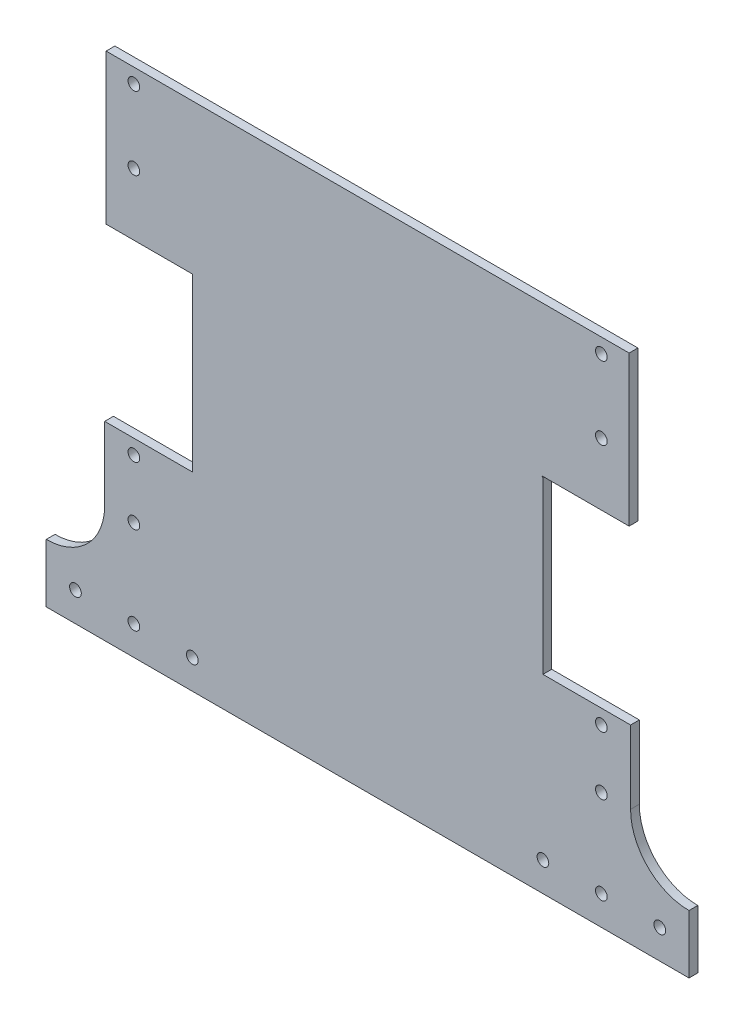
ISO-10303-21;
HEADER;
FILE_DESCRIPTION(('STEP AP214'),'2;1');
FILE_NAME('part.step','',(''),(''),'','','');
FILE_SCHEMA(('AUTOMOTIVE_DESIGN { 1 0 10303 214 1 1 1 1 }'));
ENDSEC;
DATA;
#1=APPLICATION_CONTEXT('core data for automotive mechanical design processes');
#2=APPLICATION_PROTOCOL_DEFINITION('international standard','automotive_design',2000,#1);
#3=PRODUCT_CONTEXT('',#1,'mechanical');
#4=PRODUCT('Part','Part','',(#3));
#5=PRODUCT_RELATED_PRODUCT_CATEGORY('part','',(#4));
#6=PRODUCT_DEFINITION_FORMATION('','',#4);
#7=PRODUCT_DEFINITION_CONTEXT('part definition',#1,'design');
#8=PRODUCT_DEFINITION('design','',#6,#7);
#9=PRODUCT_DEFINITION_SHAPE('','',#8);
#10=(LENGTH_UNIT() NAMED_UNIT(*) SI_UNIT(.MILLI.,.METRE.));
#11=(NAMED_UNIT(*) PLANE_ANGLE_UNIT() SI_UNIT($,.RADIAN.));
#12=(NAMED_UNIT(*) SI_UNIT($,.STERADIAN.) SOLID_ANGLE_UNIT());
#13=UNCERTAINTY_MEASURE_WITH_UNIT(LENGTH_MEASURE(1.E-05),#10,'distance_accuracy_value','');
#14=(GEOMETRIC_REPRESENTATION_CONTEXT(3) GLOBAL_UNCERTAINTY_ASSIGNED_CONTEXT((#13)) GLOBAL_UNIT_ASSIGNED_CONTEXT((#10,
#11,#12)) REPRESENTATION_CONTEXT('',''));
#15=CARTESIAN_POINT('',(0.,0.,0.));
#16=DIRECTION('',(0.,0.,1.));
#17=DIRECTION('',(1.,0.,0.));
#18=AXIS2_PLACEMENT_3D('',#15,#16,#17);
#19=CARTESIAN_POINT('',(180.,0.,3.));
#20=DIRECTION('',(-1.,0.,0.));
#21=DIRECTION('',(0.,0.,1.));
#22=AXIS2_PLACEMENT_3D('',#19,#20,#21);
#23=PLANE('',#22);
#24=DIRECTION('',(0.,1.,0.));
#25=VECTOR('',#24,1.);
#26=CARTESIAN_POINT('',(180.,0.,3.));
#27=LINE('',#26,#25);
#28=CARTESIAN_POINT('',(180.,40.,3.));
#29=VERTEX_POINT('',#28);
#30=CARTESIAN_POINT('',(180.,65.,3.));
#31=VERTEX_POINT('',#30);
#32=EDGE_CURVE('E461',#29,#31,#27,.T.);
#33=ORIENTED_EDGE('',*,*,#32,.F.);
#34=DIRECTION('',(0.,0.,-1.));
#35=VECTOR('',#34,1.);
#36=CARTESIAN_POINT('',(180.,40.,3.));
#37=LINE('',#36,#35);
#38=CARTESIAN_POINT('',(180.,40.,0.));
#39=VERTEX_POINT('',#38);
#40=EDGE_CURVE('E534',#29,#39,#37,.T.);
#41=ORIENTED_EDGE('',*,*,#40,.T.);
#42=DIRECTION('',(0.,1.,0.));
#43=VECTOR('',#42,1.);
#44=CARTESIAN_POINT('',(180.,0.,0.));
#45=LINE('',#44,#43);
#46=CARTESIAN_POINT('',(180.,65.,0.));
#47=VERTEX_POINT('',#46);
#48=EDGE_CURVE('E490',#39,#47,#45,.T.);
#49=ORIENTED_EDGE('',*,*,#48,.T.);
#50=DIRECTION('',(0.,0.,-1.));
#51=VECTOR('',#50,1.);
#52=CARTESIAN_POINT('',(180.,65.,3.));
#53=LINE('',#52,#51);
#54=EDGE_CURVE('E530',#31,#47,#53,.T.);
#55=ORIENTED_EDGE('',*,*,#54,.F.);
#56=EDGE_LOOP('',(#33,#41,#49,#55));
#57=FACE_BOUND('',#56,.T.);
#58=ADVANCED_FACE('F143',(#57),#23,.F.);
#59=CARTESIAN_POINT('',(0.,65.,3.));
#60=DIRECTION('',(0.,-1.,0.));
#61=DIRECTION('',(0.,0.,-1.));
#62=AXIS2_PLACEMENT_3D('',#59,#60,#61);
#63=PLANE('',#62);
#64=DIRECTION('',(-1.,0.,0.));
#65=VECTOR('',#64,1.);
#66=CARTESIAN_POINT('',(0.,65.,0.));
#67=LINE('',#66,#65);
#68=CARTESIAN_POINT('',(150.,65.,0.));
#69=VERTEX_POINT('',#68);
#70=EDGE_CURVE('E494',#47,#69,#67,.T.);
#71=ORIENTED_EDGE('',*,*,#70,.T.);
#72=DIRECTION('',(0.,0.,-1.));
#73=VECTOR('',#72,1.);
#74=CARTESIAN_POINT('',(150.,65.,3.));
#75=LINE('',#74,#73);
#76=CARTESIAN_POINT('',(150.,65.,3.));
#77=VERTEX_POINT('',#76);
#78=EDGE_CURVE('E527',#77,#69,#75,.T.);
#79=ORIENTED_EDGE('',*,*,#78,.F.);
#80=DIRECTION('',(-1.,0.,0.));
#81=VECTOR('',#80,1.);
#82=CARTESIAN_POINT('',(0.,65.,3.));
#83=LINE('',#82,#81);
#84=EDGE_CURVE('E465',#31,#77,#83,.T.);
#85=ORIENTED_EDGE('',*,*,#84,.F.);
#86=ORIENTED_EDGE('',*,*,#54,.T.);
#87=EDGE_LOOP('',(#71,#79,#85,#86));
#88=FACE_BOUND('',#87,.T.);
#89=ADVANCED_FACE('F637',(#88),#63,.F.);
#90=CARTESIAN_POINT('',(150.,0.,3.));
#91=DIRECTION('',(1.,0.,0.));
#92=DIRECTION('',(0.,0.,-1.));
#93=AXIS2_PLACEMENT_3D('',#90,#91,#92);
#94=PLANE('',#93);
#95=DIRECTION('',(0.,-1.,0.));
#96=VECTOR('',#95,1.);
#97=CARTESIAN_POINT('',(150.,0.,0.));
#98=LINE('',#97,#96);
#99=CARTESIAN_POINT('',(150.,123.180584191064,0.));
#100=VERTEX_POINT('',#99);
#101=EDGE_CURVE('E498',#100,#69,#98,.T.);
#102=ORIENTED_EDGE('',*,*,#101,.F.);
#103=DIRECTION('',(0.,0.,-1.));
#104=VECTOR('',#103,1.);
#105=CARTESIAN_POINT('',(150.,123.180584191064,3.));
#106=LINE('',#105,#104);
#107=CARTESIAN_POINT('',(150.,123.180584191064,3.));
#108=VERTEX_POINT('',#107);
#109=EDGE_CURVE('E524',#108,#100,#106,.T.);
#110=ORIENTED_EDGE('',*,*,#109,.F.);
#111=DIRECTION('',(0.,-1.,0.));
#112=VECTOR('',#111,1.);
#113=CARTESIAN_POINT('',(150.,0.,3.));
#114=LINE('',#113,#112);
#115=EDGE_CURVE('E468',#108,#77,#114,.T.);
#116=ORIENTED_EDGE('',*,*,#115,.T.);
#117=ORIENTED_EDGE('',*,*,#78,.T.);
#118=EDGE_LOOP('',(#102,#110,#116,#117));
#119=FACE_BOUND('',#118,.T.);
#120=ADVANCED_FACE('F624',(#119),#94,.T.);
#121=CARTESIAN_POINT('',(0.,175.,3.));
#122=DIRECTION('',(0.,1.,0.));
#123=DIRECTION('',(0.,0.,1.));
#124=AXIS2_PLACEMENT_3D('',#121,#122,#123);
#125=PLANE('',#124);
#126=DIRECTION('',(0.,0.,1.));
#127=VECTOR('',#126,1.);
#128=CARTESIAN_POINT('',(0.5,175.,-7.));
#129=LINE('',#128,#127);
#130=CARTESIAN_POINT('',(0.5,175.,0.));
#131=VERTEX_POINT('',#130);
#132=CARTESIAN_POINT('',(0.5,175.,3.));
#133=VERTEX_POINT('',#132);
#134=EDGE_CURVE('E301',#131,#133,#129,.T.);
#135=ORIENTED_EDGE('',*,*,#134,.T.);
#136=DIRECTION('',(1.,0.,0.));
#137=VECTOR('',#136,1.);
#138=CARTESIAN_POINT('',(0.,175.,3.));
#139=LINE('',#138,#137);
#140=CARTESIAN_POINT('',(179.5,175.,3.));
#141=VERTEX_POINT('',#140);
#142=EDGE_CURVE('E472',#133,#141,#139,.T.);
#143=ORIENTED_EDGE('',*,*,#142,.T.);
#144=DIRECTION('',(0.,0.,1.));
#145=VECTOR('',#144,1.);
#146=CARTESIAN_POINT('',(179.5,175.,-7.));
#147=LINE('',#146,#145);
#148=CARTESIAN_POINT('',(179.5,175.,0.));
#149=VERTEX_POINT('',#148);
#150=EDGE_CURVE('E159',#149,#141,#147,.T.);
#151=ORIENTED_EDGE('',*,*,#150,.F.);
#152=DIRECTION('',(1.,0.,0.));
#153=VECTOR('',#152,1.);
#154=CARTESIAN_POINT('',(0.,175.,0.));
#155=LINE('',#154,#153);
#156=EDGE_CURVE('E502',#131,#149,#155,.T.);
#157=ORIENTED_EDGE('',*,*,#156,.F.);
#158=EDGE_LOOP('',(#135,#143,#151,#157));
#159=FACE_BOUND('',#158,.T.);
#160=ADVANCED_FACE('F616',(#159),#125,.T.);
#161=CARTESIAN_POINT('',(30.0000000000001,0.,3.));
#162=DIRECTION('',(1.,0.,0.));
#163=DIRECTION('',(0.,1.,0.));
#164=AXIS2_PLACEMENT_3D('',#161,#162,#163);
#165=PLANE('',#164);
#166=DIRECTION('',(0.,-1.,0.));
#167=VECTOR('',#166,1.);
#168=CARTESIAN_POINT('',(30.0000000000001,0.,0.));
#169=LINE('',#168,#167);
#170=CARTESIAN_POINT('',(30.,123.180584191064,0.));
#171=VERTEX_POINT('',#170);
#172=CARTESIAN_POINT('',(30.,65.,0.));
#173=VERTEX_POINT('',#172);
#174=EDGE_CURVE('E506',#171,#173,#169,.T.);
#175=ORIENTED_EDGE('',*,*,#174,.T.);
#176=DIRECTION('',(0.,0.,-1.));
#177=VECTOR('',#176,1.);
#178=CARTESIAN_POINT('',(30.,65.,3.));
#179=LINE('',#178,#177);
#180=CARTESIAN_POINT('',(30.,65.,3.));
#181=VERTEX_POINT('',#180);
#182=EDGE_CURVE('E519',#181,#173,#179,.T.);
#183=ORIENTED_EDGE('',*,*,#182,.F.);
#184=DIRECTION('',(0.,-1.,0.));
#185=VECTOR('',#184,1.);
#186=CARTESIAN_POINT('',(30.0000000000001,0.,3.));
#187=LINE('',#186,#185);
#188=CARTESIAN_POINT('',(30.,123.180584191064,3.));
#189=VERTEX_POINT('',#188);
#190=EDGE_CURVE('E476',#189,#181,#187,.T.);
#191=ORIENTED_EDGE('',*,*,#190,.F.);
#192=DIRECTION('',(0.,0.,-1.));
#193=VECTOR('',#192,1.);
#194=CARTESIAN_POINT('',(30.,123.180584191064,3.));
#195=LINE('',#194,#193);
#196=EDGE_CURVE('E287',#189,#171,#195,.T.);
#197=ORIENTED_EDGE('',*,*,#196,.T.);
#198=EDGE_LOOP('',(#175,#183,#191,#197));
#199=FACE_BOUND('',#198,.T.);
#200=ADVANCED_FACE('F614',(#199),#165,.F.);
#201=CARTESIAN_POINT('',(0.,65.,3.));
#202=DIRECTION('',(0.,1.,0.));
#203=DIRECTION('',(-1.,0.,0.));
#204=AXIS2_PLACEMENT_3D('',#201,#202,#203);
#205=PLANE('',#204);
#206=DIRECTION('',(1.,0.,0.));
#207=VECTOR('',#206,1.);
#208=CARTESIAN_POINT('',(0.,65.,0.));
#209=LINE('',#208,#207);
#210=CARTESIAN_POINT('',(0.,65.,0.));
#211=VERTEX_POINT('',#210);
#212=EDGE_CURVE('E510',#211,#173,#209,.T.);
#213=ORIENTED_EDGE('',*,*,#212,.F.);
#214=DIRECTION('',(0.,0.,-1.));
#215=VECTOR('',#214,1.);
#216=CARTESIAN_POINT('',(0.,65.,3.));
#217=LINE('',#216,#215);
#218=CARTESIAN_POINT('',(0.,65.,3.));
#219=VERTEX_POINT('',#218);
#220=EDGE_CURVE('E486',#219,#211,#217,.T.);
#221=ORIENTED_EDGE('',*,*,#220,.F.);
#222=DIRECTION('',(1.,0.,0.));
#223=VECTOR('',#222,1.);
#224=CARTESIAN_POINT('',(0.,65.,3.));
#225=LINE('',#224,#223);
#226=EDGE_CURVE('E479',#219,#181,#225,.T.);
#227=ORIENTED_EDGE('',*,*,#226,.T.);
#228=ORIENTED_EDGE('',*,*,#182,.T.);
#229=EDGE_LOOP('',(#213,#221,#227,#228));
#230=FACE_BOUND('',#229,.T.);
#231=ADVANCED_FACE('F611',(#230),#205,.T.);
#232=CARTESIAN_POINT('',(0.,0.,3.));
#233=DIRECTION('',(-1.,0.,0.));
#234=DIRECTION('',(0.,0.,1.));
#235=AXIS2_PLACEMENT_3D('',#232,#233,#234);
#236=PLANE('',#235);
#237=DIRECTION('',(0.,1.,0.));
#238=VECTOR('',#237,1.);
#239=CARTESIAN_POINT('',(0.,0.,0.));
#240=LINE('',#239,#238);
#241=CARTESIAN_POINT('',(0.,40.,0.));
#242=VERTEX_POINT('',#241);
#243=EDGE_CURVE('E462',#242,#211,#240,.T.);
#244=ORIENTED_EDGE('',*,*,#243,.F.);
#245=DIRECTION('',(0.,0.,-1.));
#246=VECTOR('',#245,1.);
#247=CARTESIAN_POINT('',(0.,40.,3.));
#248=LINE('',#247,#246);
#249=CARTESIAN_POINT('',(0.,40.,3.));
#250=VERTEX_POINT('',#249);
#251=EDGE_CURVE('E566',#242,#250,#248,.F.);
#252=ORIENTED_EDGE('',*,*,#251,.T.);
#253=DIRECTION('',(0.,1.,0.));
#254=VECTOR('',#253,1.);
#255=CARTESIAN_POINT('',(0.,0.,3.));
#256=LINE('',#255,#254);
#257=EDGE_CURVE('E483',#250,#219,#256,.T.);
#258=ORIENTED_EDGE('',*,*,#257,.T.);
#259=ORIENTED_EDGE('',*,*,#220,.T.);
#260=EDGE_LOOP('',(#244,#252,#258,#259));
#261=FACE_BOUND('',#260,.T.);
#262=ADVANCED_FACE('F605',(#261),#236,.T.);
#263=CARTESIAN_POINT('',(0.,0.,3.));
#264=DIRECTION('',(0.,1.,0.));
#265=DIRECTION('',(0.,0.,1.));
#266=AXIS2_PLACEMENT_3D('',#263,#264,#265);
#267=PLANE('',#266);
#268=DIRECTION('',(1.,0.,0.));
#269=VECTOR('',#268,1.);
#270=CARTESIAN_POINT('',(0.,0.,0.));
#271=LINE('',#270,#269);
#272=CARTESIAN_POINT('',(-20.,0.,0.));
#273=VERTEX_POINT('',#272);
#274=CARTESIAN_POINT('',(200.,0.,0.));
#275=VERTEX_POINT('',#274);
#276=EDGE_CURVE('E487',#273,#275,#271,.T.);
#277=ORIENTED_EDGE('',*,*,#276,.T.);
#278=DIRECTION('',(0.,0.,-1.));
#279=VECTOR('',#278,1.);
#280=CARTESIAN_POINT('',(200.,0.,3.));
#281=LINE('',#280,#279);
#282=CARTESIAN_POINT('',(200.,0.,3.));
#283=VERTEX_POINT('',#282);
#284=EDGE_CURVE('E543',#283,#275,#281,.T.);
#285=ORIENTED_EDGE('',*,*,#284,.F.);
#286=DIRECTION('',(1.,0.,0.));
#287=VECTOR('',#286,1.);
#288=CARTESIAN_POINT('',(0.,0.,3.));
#289=LINE('',#288,#287);
#290=CARTESIAN_POINT('',(-20.,0.,3.));
#291=VERTEX_POINT('',#290);
#292=EDGE_CURVE('E458',#291,#283,#289,.T.);
#293=ORIENTED_EDGE('',*,*,#292,.F.);
#294=DIRECTION('',(0.,0.,-1.));
#295=VECTOR('',#294,1.);
#296=CARTESIAN_POINT('',(-20.,0.,3.));
#297=LINE('',#296,#295);
#298=EDGE_CURVE('E539',#291,#273,#297,.T.);
#299=ORIENTED_EDGE('',*,*,#298,.T.);
#300=EDGE_LOOP('',(#277,#285,#293,#299));
#301=FACE_BOUND('',#300,.T.);
#302=ADVANCED_FACE('F593',(#301),#267,.F.);
#303=CARTESIAN_POINT('',(0.,0.,0.));
#304=DIRECTION('',(0.,0.,1.));
#305=DIRECTION('',(1.,0.,0.));
#306=AXIS2_PLACEMENT_3D('',#303,#304,#305);
#307=PLANE('',#306);
#308=CARTESIAN_POINT('',(10.0000000000001,40.,0.));
#309=DIRECTION('',(0.,0.,1.));
#310=DIRECTION('',(-1.,0.,0.));
#311=AXIS2_PLACEMENT_3D('',#308,#309,#310);
#312=CIRCLE('',#311,2.);
#313=CARTESIAN_POINT('',(8.0000000000001,40.,0.));
#314=VERTEX_POINT('',#313);
#315=EDGE_CURVE('E358',#314,#314,#312,.T.);
#316=ORIENTED_EDGE('',*,*,#315,.T.);
#317=EDGE_LOOP('',(#316));
#318=FACE_BOUND('',#317,.T.);
#319=CARTESIAN_POINT('',(10.,60.,0.));
#320=DIRECTION('',(0.,0.,1.));
#321=DIRECTION('',(-1.,0.,0.));
#322=AXIS2_PLACEMENT_3D('',#319,#320,#321);
#323=CIRCLE('',#322,2.);
#324=CARTESIAN_POINT('',(8.00000000000004,60.,0.));
#325=VERTEX_POINT('',#324);
#326=EDGE_CURVE('E407',#325,#325,#323,.T.);
#327=ORIENTED_EDGE('',*,*,#326,.T.);
#328=EDGE_LOOP('',(#327));
#329=FACE_BOUND('',#328,.T.);
#330=CARTESIAN_POINT('',(30.,9.99999999999999,0.));
#331=DIRECTION('',(0.,0.,1.));
#332=DIRECTION('',(-1.,0.,0.));
#333=AXIS2_PLACEMENT_3D('',#330,#331,#332);
#334=CIRCLE('',#333,2.);
#335=CARTESIAN_POINT('',(28.,9.99999999999999,0.));
#336=VERTEX_POINT('',#335);
#337=EDGE_CURVE('E399',#336,#336,#334,.T.);
#338=ORIENTED_EDGE('',*,*,#337,.T.);
#339=EDGE_LOOP('',(#338));
#340=FACE_BOUND('',#339,.T.);
#341=CARTESIAN_POINT('',(170.,60.,0.));
#342=DIRECTION('',(0.,0.,1.));
#343=DIRECTION('',(1.,0.,0.));
#344=AXIS2_PLACEMENT_3D('',#341,#342,#343);
#345=CIRCLE('',#344,2.);
#346=CARTESIAN_POINT('',(172.,60.,0.));
#347=VERTEX_POINT('',#346);
#348=EDGE_CURVE('E391',#347,#347,#345,.T.);
#349=ORIENTED_EDGE('',*,*,#348,.T.);
#350=EDGE_LOOP('',(#349));
#351=FACE_BOUND('',#350,.T.);
#352=CARTESIAN_POINT('',(170.,9.99999999999999,0.));
#353=DIRECTION('',(0.,0.,1.));
#354=DIRECTION('',(1.,0.,0.));
#355=AXIS2_PLACEMENT_3D('',#352,#353,#354);
#356=CIRCLE('',#355,2.);
#357=CARTESIAN_POINT('',(172.,9.99999999999999,0.));
#358=VERTEX_POINT('',#357);
#359=EDGE_CURVE('E439',#358,#358,#356,.T.);
#360=ORIENTED_EDGE('',*,*,#359,.T.);
#361=EDGE_LOOP('',(#360));
#362=FACE_BOUND('',#361,.T.);
#363=CARTESIAN_POINT('',(150.,9.99999999999999,0.));
#364=DIRECTION('',(0.,0.,1.));
#365=DIRECTION('',(1.,0.,0.));
#366=AXIS2_PLACEMENT_3D('',#363,#364,#365);
#367=CIRCLE('',#366,2.);
#368=CARTESIAN_POINT('',(152.,9.99999999999999,0.));
#369=VERTEX_POINT('',#368);
#370=EDGE_CURVE('E422',#369,#369,#367,.T.);
#371=ORIENTED_EDGE('',*,*,#370,.T.);
#372=EDGE_LOOP('',(#371));
#373=FACE_BOUND('',#372,.T.);
#374=CARTESIAN_POINT('',(190.,9.99999999999999,0.));
#375=DIRECTION('',(0.,0.,1.));
#376=DIRECTION('',(1.,0.,0.));
#377=AXIS2_PLACEMENT_3D('',#374,#375,#376);
#378=CIRCLE('',#377,2.);
#379=CARTESIAN_POINT('',(192.,9.99999999999999,0.));
#380=VERTEX_POINT('',#379);
#381=EDGE_CURVE('E423',#380,#380,#378,.T.);
#382=ORIENTED_EDGE('',*,*,#381,.T.);
#383=EDGE_LOOP('',(#382));
#384=FACE_BOUND('',#383,.T.);
#385=CARTESIAN_POINT('',(170.,40.,0.));
#386=DIRECTION('',(0.,0.,1.));
#387=DIRECTION('',(1.,0.,0.));
#388=AXIS2_PLACEMENT_3D('',#385,#386,#387);
#389=CIRCLE('',#388,2.);
#390=CARTESIAN_POINT('',(172.,40.,0.));
#391=VERTEX_POINT('',#390);
#392=EDGE_CURVE('E390',#391,#391,#389,.T.);
#393=ORIENTED_EDGE('',*,*,#392,.T.);
#394=EDGE_LOOP('',(#393));
#395=FACE_BOUND('',#394,.T.);
#396=CARTESIAN_POINT('',(10.,145.,0.));
#397=DIRECTION('',(0.,0.,1.));
#398=DIRECTION('',(-1.,0.,0.));
#399=AXIS2_PLACEMENT_3D('',#396,#397,#398);
#400=CIRCLE('',#399,2.);
#401=CARTESIAN_POINT('',(8.00000000000004,145.,0.));
#402=VERTEX_POINT('',#401);
#403=EDGE_CURVE('E345',#402,#402,#400,.T.);
#404=ORIENTED_EDGE('',*,*,#403,.T.);
#405=EDGE_LOOP('',(#404));
#406=FACE_BOUND('',#405,.T.);
#407=CARTESIAN_POINT('',(10.,170.,0.));
#408=DIRECTION('',(0.,0.,1.));
#409=DIRECTION('',(-1.,0.,0.));
#410=AXIS2_PLACEMENT_3D('',#407,#408,#409);
#411=CIRCLE('',#410,2.);
#412=CARTESIAN_POINT('',(8.00000000000004,170.,0.));
#413=VERTEX_POINT('',#412);
#414=EDGE_CURVE('E350',#413,#413,#411,.T.);
#415=ORIENTED_EDGE('',*,*,#414,.T.);
#416=EDGE_LOOP('',(#415));
#417=FACE_BOUND('',#416,.T.);
#418=CARTESIAN_POINT('',(170.,145.,0.));
#419=DIRECTION('',(0.,0.,1.));
#420=DIRECTION('',(1.,0.,0.));
#421=AXIS2_PLACEMENT_3D('',#418,#419,#420);
#422=CIRCLE('',#421,2.);
#423=CARTESIAN_POINT('',(172.,145.,0.));
#424=VERTEX_POINT('',#423);
#425=EDGE_CURVE('E375',#424,#424,#422,.T.);
#426=ORIENTED_EDGE('',*,*,#425,.T.);
#427=EDGE_LOOP('',(#426));
#428=FACE_BOUND('',#427,.T.);
#429=CARTESIAN_POINT('',(10.,9.99999999999999,0.));
#430=DIRECTION('',(0.,0.,1.));
#431=DIRECTION('',(-1.,0.,0.));
#432=AXIS2_PLACEMENT_3D('',#429,#430,#431);
#433=CIRCLE('',#432,2.);
#434=CARTESIAN_POINT('',(8.00000000000004,9.99999999999999,0.));
#435=VERTEX_POINT('',#434);
#436=EDGE_CURVE('E367',#435,#435,#433,.T.);
#437=ORIENTED_EDGE('',*,*,#436,.T.);
#438=EDGE_LOOP('',(#437));
#439=FACE_BOUND('',#438,.T.);
#440=CARTESIAN_POINT('',(-9.99999999999995,9.99999999999999,0.));
#441=DIRECTION('',(0.,0.,1.));
#442=DIRECTION('',(-1.,0.,0.));
#443=AXIS2_PLACEMENT_3D('',#440,#441,#442);
#444=CIRCLE('',#443,2.);
#445=CARTESIAN_POINT('',(-12.,9.99999999999999,0.));
#446=VERTEX_POINT('',#445);
#447=EDGE_CURVE('E359',#446,#446,#444,.T.);
#448=ORIENTED_EDGE('',*,*,#447,.T.);
#449=EDGE_LOOP('',(#448));
#450=FACE_BOUND('',#449,.T.);
#451=CARTESIAN_POINT('',(170.,170.,0.));
#452=DIRECTION('',(0.,0.,1.));
#453=DIRECTION('',(1.,0.,0.));
#454=AXIS2_PLACEMENT_3D('',#451,#452,#453);
#455=CIRCLE('',#454,2.);
#456=CARTESIAN_POINT('',(172.,170.,0.));
#457=VERTEX_POINT('',#456);
#458=EDGE_CURVE('E450',#457,#457,#455,.T.);
#459=ORIENTED_EDGE('',*,*,#458,.T.);
#460=EDGE_LOOP('',(#459));
#461=FACE_BOUND('',#460,.T.);
#462=DIRECTION('',(-1.,0.,0.));
#463=VECTOR('',#462,1.);
#464=CARTESIAN_POINT('',(0.,123.680584191064,0.));
#465=LINE('',#464,#463);
#466=CARTESIAN_POINT('',(30.0552885720755,123.680584191064,0.));
#467=VERTEX_POINT('',#466);
#468=CARTESIAN_POINT('',(0.500000000000006,123.680584191064,0.));
#469=VERTEX_POINT('',#468);
#470=EDGE_CURVE('E276',#467,#469,#465,.T.);
#471=ORIENTED_EDGE('',*,*,#470,.T.);
#472=DIRECTION('',(0.,1.,0.));
#473=VECTOR('',#472,1.);
#474=CARTESIAN_POINT('',(0.500000000000022,0.,0.));
#475=LINE('',#474,#473);
#476=EDGE_CURVE('E341',#469,#131,#475,.T.);
#477=ORIENTED_EDGE('',*,*,#476,.T.);
#478=ORIENTED_EDGE('',*,*,#156,.T.);
#479=DIRECTION('',(0.,-1.,0.));
#480=VECTOR('',#479,1.);
#481=CARTESIAN_POINT('',(179.5,0.,0.));
#482=LINE('',#481,#480);
#483=CARTESIAN_POINT('',(179.5,123.680584191064,0.));
#484=VERTEX_POINT('',#483);
#485=EDGE_CURVE('E305',#149,#484,#482,.T.);
#486=ORIENTED_EDGE('',*,*,#485,.T.);
#487=DIRECTION('',(-1.,0.,0.));
#488=VECTOR('',#487,1.);
#489=CARTESIAN_POINT('',(0.,123.680584191064,0.));
#490=LINE('',#489,#488);
#491=CARTESIAN_POINT('',(149.725032108933,123.680584191064,0.));
#492=VERTEX_POINT('',#491);
#493=EDGE_CURVE('E328',#484,#492,#490,.T.);
#494=ORIENTED_EDGE('',*,*,#493,.T.);
#495=DIRECTION('',(0.481875547466029,-0.876239668557818,0.));
#496=VECTOR('',#495,1.);
#497=CARTESIAN_POINT('',(167.180974915411,91.9388001981932,0.));
#498=LINE('',#497,#496);
#499=EDGE_CURVE('E332',#492,#100,#498,.T.);
#500=ORIENTED_EDGE('',*,*,#499,.T.);
#501=ORIENTED_EDGE('',*,*,#101,.T.);
#502=ORIENTED_EDGE('',*,*,#70,.F.);
#503=ORIENTED_EDGE('',*,*,#48,.F.);
#504=CARTESIAN_POINT('',(200.,40.,0.));
#505=DIRECTION('',(0.,0.,1.));
#506=DIRECTION('',(1.,0.,0.));
#507=AXIS2_PLACEMENT_3D('',#504,#505,#506);
#508=CIRCLE('',#507,20.);
#509=CARTESIAN_POINT('',(200.,20.,0.));
#510=VERTEX_POINT('',#509);
#511=EDGE_CURVE('E569',#39,#510,#508,.T.);
#512=ORIENTED_EDGE('',*,*,#511,.T.);
#513=DIRECTION('',(0.,1.,0.));
#514=VECTOR('',#513,1.);
#515=CARTESIAN_POINT('',(200.,0.,0.));
#516=LINE('',#515,#514);
#517=EDGE_CURVE('E454',#275,#510,#516,.T.);
#518=ORIENTED_EDGE('',*,*,#517,.F.);
#519=ORIENTED_EDGE('',*,*,#276,.F.);
#520=DIRECTION('',(0.,1.,0.));
#521=VECTOR('',#520,1.);
#522=CARTESIAN_POINT('',(-20.,0.,0.));
#523=LINE('',#522,#521);
#524=CARTESIAN_POINT('',(-20.,20.,0.));
#525=VERTEX_POINT('',#524);
#526=EDGE_CURVE('E540',#273,#525,#523,.T.);
#527=ORIENTED_EDGE('',*,*,#526,.T.);
#528=CARTESIAN_POINT('',(-20.,40.,0.));
#529=DIRECTION('',(0.,0.,1.));
#530=DIRECTION('',(1.,0.,0.));
#531=AXIS2_PLACEMENT_3D('',#528,#529,#530);
#532=CIRCLE('',#531,20.);
#533=EDGE_CURVE('E152',#525,#242,#532,.T.);
#534=ORIENTED_EDGE('',*,*,#533,.T.);
#535=ORIENTED_EDGE('',*,*,#243,.T.);
#536=ORIENTED_EDGE('',*,*,#212,.T.);
#537=ORIENTED_EDGE('',*,*,#174,.F.);
#538=DIRECTION('',(0.109907250947462,0.993941847488661,0.));
#539=VECTOR('',#538,1.);
#540=CARTESIAN_POINT('',(16.1811904376537,-1.78926982755917,0.));
#541=LINE('',#540,#539);
#542=EDGE_CURVE('E336',#171,#467,#541,.T.);
#543=ORIENTED_EDGE('',*,*,#542,.T.);
#544=EDGE_LOOP('',(#471,#477,#478,#486,#494,#500,#501,#502,#503,#512,#518,#519,#527,#534,#535,
#536,#537,#543));
#545=FACE_BOUND('',#544,.T.);
#546=ADVANCED_FACE('F587',(#318,#329,#340,#351,#362,#373,#384,#395,#406,#417,#428,#439,#450,
#461,#545),#307,.F.);
#547=CARTESIAN_POINT('',(0.,0.,3.));
#548=DIRECTION('',(0.,0.,1.));
#549=DIRECTION('',(1.,0.,0.));
#550=AXIS2_PLACEMENT_3D('',#547,#548,#549);
#551=PLANE('',#550);
#552=DIRECTION('',(0.,1.,0.));
#553=VECTOR('',#552,1.);
#554=CARTESIAN_POINT('',(0.5,175.,3.));
#555=LINE('',#554,#553);
#556=CARTESIAN_POINT('',(0.500000000000006,123.680584191064,3.));
#557=VERTEX_POINT('',#556);
#558=EDGE_CURVE('E281',#557,#133,#555,.T.);
#559=ORIENTED_EDGE('',*,*,#558,.F.);
#560=DIRECTION('',(-1.,0.,0.));
#561=VECTOR('',#560,1.);
#562=CARTESIAN_POINT('',(0.500000000000006,123.680584191064,3.));
#563=LINE('',#562,#561);
#564=CARTESIAN_POINT('',(30.0552885720755,123.680584191064,3.));
#565=VERTEX_POINT('',#564);
#566=EDGE_CURVE('E273',#565,#557,#563,.T.);
#567=ORIENTED_EDGE('',*,*,#566,.F.);
#568=DIRECTION('',(0.109907250947462,0.99394184748866,0.));
#569=VECTOR('',#568,1.);
#570=CARTESIAN_POINT('',(30.0552885720755,123.680584191064,3.));
#571=LINE('',#570,#569);
#572=EDGE_CURVE('E284',#189,#565,#571,.T.);
#573=ORIENTED_EDGE('',*,*,#572,.F.);
#574=ORIENTED_EDGE('',*,*,#190,.T.);
#575=ORIENTED_EDGE('',*,*,#226,.F.);
#576=ORIENTED_EDGE('',*,*,#257,.F.);
#577=CARTESIAN_POINT('',(-20.,40.,3.));
#578=DIRECTION('',(0.,0.,1.));
#579=DIRECTION('',(1.,0.,0.));
#580=AXIS2_PLACEMENT_3D('',#577,#578,#579);
#581=CIRCLE('',#580,20.);
#582=CARTESIAN_POINT('',(-20.,20.,3.));
#583=VERTEX_POINT('',#582);
#584=EDGE_CURVE('E12',#250,#583,#581,.F.);
#585=ORIENTED_EDGE('',*,*,#584,.T.);
#586=DIRECTION('',(0.,1.,0.));
#587=VECTOR('',#586,1.);
#588=CARTESIAN_POINT('',(-20.,0.,3.));
#589=LINE('',#588,#587);
#590=EDGE_CURVE('E535',#291,#583,#589,.T.);
#591=ORIENTED_EDGE('',*,*,#590,.F.);
#592=ORIENTED_EDGE('',*,*,#292,.T.);
#593=DIRECTION('',(0.,1.,0.));
#594=VECTOR('',#593,1.);
#595=CARTESIAN_POINT('',(200.,0.,3.));
#596=LINE('',#595,#594);
#597=CARTESIAN_POINT('',(200.,20.,3.));
#598=VERTEX_POINT('',#597);
#599=EDGE_CURVE('E550',#283,#598,#596,.T.);
#600=ORIENTED_EDGE('',*,*,#599,.T.);
#601=CARTESIAN_POINT('',(200.,40.,3.));
#602=DIRECTION('',(0.,0.,1.));
#603=DIRECTION('',(1.,0.,0.));
#604=AXIS2_PLACEMENT_3D('',#601,#602,#603);
#605=CIRCLE('',#604,20.);
#606=EDGE_CURVE('E572',#598,#29,#605,.F.);
#607=ORIENTED_EDGE('',*,*,#606,.T.);
#608=ORIENTED_EDGE('',*,*,#32,.T.);
#609=ORIENTED_EDGE('',*,*,#84,.T.);
#610=ORIENTED_EDGE('',*,*,#115,.F.);
#611=DIRECTION('',(0.481875547466029,-0.876239668557818,0.));
#612=VECTOR('',#611,1.);
#613=CARTESIAN_POINT('',(149.725032108933,123.680584191064,3.));
#614=LINE('',#613,#612);
#615=CARTESIAN_POINT('',(149.725032108933,123.680584191064,3.));
#616=VERTEX_POINT('',#615);
#617=EDGE_CURVE('E310',#616,#108,#614,.T.);
#618=ORIENTED_EDGE('',*,*,#617,.F.);
#619=DIRECTION('',(-1.,0.,0.));
#620=VECTOR('',#619,1.);
#621=CARTESIAN_POINT('',(179.5,123.680584191064,3.));
#622=LINE('',#621,#620);
#623=CARTESIAN_POINT('',(179.5,123.680584191064,3.));
#624=VERTEX_POINT('',#623);
#625=EDGE_CURVE('E319',#624,#616,#622,.T.);
#626=ORIENTED_EDGE('',*,*,#625,.F.);
#627=DIRECTION('',(0.,-1.,0.));
#628=VECTOR('',#627,1.);
#629=CARTESIAN_POINT('',(179.5,175.,3.));
#630=LINE('',#629,#628);
#631=EDGE_CURVE('E291',#141,#624,#630,.T.);
#632=ORIENTED_EDGE('',*,*,#631,.F.);
#633=ORIENTED_EDGE('',*,*,#142,.F.);
#634=EDGE_LOOP('',(#559,#567,#573,#574,#575,#576,#585,#591,#592,#600,#607,#608,#609,#610,#618,
#626,#632,#633));
#635=FACE_BOUND('',#634,.T.);
#636=CARTESIAN_POINT('',(10.0000000000001,40.,3.));
#637=DIRECTION('',(0.,0.,1.));
#638=DIRECTION('',(-1.,0.,0.));
#639=AXIS2_PLACEMENT_3D('',#636,#637,#638);
#640=CIRCLE('',#639,2.);
#641=CARTESIAN_POINT('',(8.0000000000001,40.,3.));
#642=VERTEX_POINT('',#641);
#643=EDGE_CURVE('E411',#642,#642,#640,.T.);
#644=ORIENTED_EDGE('',*,*,#643,.F.);
#645=EDGE_LOOP('',(#644));
#646=FACE_BOUND('',#645,.T.);
#647=CARTESIAN_POINT('',(10.,60.,3.));
#648=DIRECTION('',(0.,0.,1.));
#649=DIRECTION('',(-1.,0.,0.));
#650=AXIS2_PLACEMENT_3D('',#647,#648,#649);
#651=CIRCLE('',#650,2.);
#652=CARTESIAN_POINT('',(8.00000000000004,60.,3.));
#653=VERTEX_POINT('',#652);
#654=EDGE_CURVE('E403',#653,#653,#651,.T.);
#655=ORIENTED_EDGE('',*,*,#654,.F.);
#656=EDGE_LOOP('',(#655));
#657=FACE_BOUND('',#656,.T.);
#658=CARTESIAN_POINT('',(30.,9.99999999999999,3.));
#659=DIRECTION('',(0.,0.,1.));
#660=DIRECTION('',(-1.,0.,0.));
#661=AXIS2_PLACEMENT_3D('',#658,#659,#660);
#662=CIRCLE('',#661,2.);
#663=CARTESIAN_POINT('',(28.,9.99999999999999,3.));
#664=VERTEX_POINT('',#663);
#665=EDGE_CURVE('E395',#664,#664,#662,.T.);
#666=ORIENTED_EDGE('',*,*,#665,.F.);
#667=EDGE_LOOP('',(#666));
#668=FACE_BOUND('',#667,.T.);
#669=CARTESIAN_POINT('',(170.,60.,3.));
#670=DIRECTION('',(0.,0.,1.));
#671=DIRECTION('',(1.,0.,0.));
#672=AXIS2_PLACEMENT_3D('',#669,#670,#671);
#673=CIRCLE('',#672,2.);
#674=CARTESIAN_POINT('',(172.,60.,3.));
#675=VERTEX_POINT('',#674);
#676=EDGE_CURVE('E386',#675,#675,#673,.T.);
#677=ORIENTED_EDGE('',*,*,#676,.F.);
#678=EDGE_LOOP('',(#677));
#679=FACE_BOUND('',#678,.T.);
#680=CARTESIAN_POINT('',(170.,9.99999999999999,3.));
#681=DIRECTION('',(0.,0.,1.));
#682=DIRECTION('',(1.,0.,0.));
#683=AXIS2_PLACEMENT_3D('',#680,#681,#682);
#684=CIRCLE('',#683,2.);
#685=CARTESIAN_POINT('',(172.,9.99999999999999,3.));
#686=VERTEX_POINT('',#685);
#687=EDGE_CURVE('E434',#686,#686,#684,.T.);
#688=ORIENTED_EDGE('',*,*,#687,.F.);
#689=EDGE_LOOP('',(#688));
#690=FACE_BOUND('',#689,.T.);
#691=CARTESIAN_POINT('',(150.,9.99999999999999,3.));
#692=DIRECTION('',(0.,0.,1.));
#693=DIRECTION('',(1.,0.,0.));
#694=AXIS2_PLACEMENT_3D('',#691,#692,#693);
#695=CIRCLE('',#694,2.);
#696=CARTESIAN_POINT('',(152.,9.99999999999999,3.));
#697=VERTEX_POINT('',#696);
#698=EDGE_CURVE('E443',#697,#697,#695,.T.);
#699=ORIENTED_EDGE('',*,*,#698,.F.);
#700=EDGE_LOOP('',(#699));
#701=FACE_BOUND('',#700,.T.);
#702=CARTESIAN_POINT('',(190.,9.99999999999999,3.));
#703=DIRECTION('',(0.,0.,1.));
#704=DIRECTION('',(1.,0.,0.));
#705=AXIS2_PLACEMENT_3D('',#702,#703,#704);
#706=CIRCLE('',#705,2.);
#707=CARTESIAN_POINT('',(192.,9.99999999999999,3.));
#708=VERTEX_POINT('',#707);
#709=EDGE_CURVE('E418',#708,#708,#706,.T.);
#710=ORIENTED_EDGE('',*,*,#709,.F.);
#711=EDGE_LOOP('',(#710));
#712=FACE_BOUND('',#711,.T.);
#713=CARTESIAN_POINT('',(170.,40.,3.));
#714=DIRECTION('',(0.,0.,1.));
#715=DIRECTION('',(1.,0.,0.));
#716=AXIS2_PLACEMENT_3D('',#713,#714,#715);
#717=CIRCLE('',#716,2.);
#718=CARTESIAN_POINT('',(172.,40.,3.));
#719=VERTEX_POINT('',#718);
#720=EDGE_CURVE('E427',#719,#719,#717,.T.);
#721=ORIENTED_EDGE('',*,*,#720,.F.);
#722=EDGE_LOOP('',(#721));
#723=FACE_BOUND('',#722,.T.);
#724=CARTESIAN_POINT('',(10.,145.,3.));
#725=DIRECTION('',(0.,0.,1.));
#726=DIRECTION('',(-1.,0.,0.));
#727=AXIS2_PLACEMENT_3D('',#724,#725,#726);
#728=CIRCLE('',#727,2.);
#729=CARTESIAN_POINT('',(8.00000000000004,145.,3.));
#730=VERTEX_POINT('',#729);
#731=EDGE_CURVE('E346',#730,#730,#728,.T.);
#732=ORIENTED_EDGE('',*,*,#731,.F.);
#733=EDGE_LOOP('',(#732));
#734=FACE_BOUND('',#733,.T.);
#735=CARTESIAN_POINT('',(10.,170.,3.));
#736=DIRECTION('',(0.,0.,1.));
#737=DIRECTION('',(-1.,0.,0.));
#738=AXIS2_PLACEMENT_3D('',#735,#736,#737);
#739=CIRCLE('',#738,2.);
#740=CARTESIAN_POINT('',(8.00000000000004,170.,3.));
#741=VERTEX_POINT('',#740);
#742=EDGE_CURVE('E379',#741,#741,#739,.T.);
#743=ORIENTED_EDGE('',*,*,#742,.F.);
#744=EDGE_LOOP('',(#743));
#745=FACE_BOUND('',#744,.T.);
#746=CARTESIAN_POINT('',(170.,145.,3.));
#747=DIRECTION('',(0.,0.,1.));
#748=DIRECTION('',(1.,0.,0.));
#749=AXIS2_PLACEMENT_3D('',#746,#747,#748);
#750=CIRCLE('',#749,2.);
#751=CARTESIAN_POINT('',(172.,145.,3.));
#752=VERTEX_POINT('',#751);
#753=EDGE_CURVE('E371',#752,#752,#750,.T.);
#754=ORIENTED_EDGE('',*,*,#753,.F.);
#755=EDGE_LOOP('',(#754));
#756=FACE_BOUND('',#755,.T.);
#757=CARTESIAN_POINT('',(10.,9.99999999999999,3.));
#758=DIRECTION('',(0.,0.,1.));
#759=DIRECTION('',(-1.,0.,0.));
#760=AXIS2_PLACEMENT_3D('',#757,#758,#759);
#761=CIRCLE('',#760,2.);
#762=CARTESIAN_POINT('',(8.00000000000004,9.99999999999999,3.));
#763=VERTEX_POINT('',#762);
#764=EDGE_CURVE('E363',#763,#763,#761,.T.);
#765=ORIENTED_EDGE('',*,*,#764,.F.);
#766=EDGE_LOOP('',(#765));
#767=FACE_BOUND('',#766,.T.);
#768=CARTESIAN_POINT('',(-9.99999999999995,9.99999999999999,3.));
#769=DIRECTION('',(0.,0.,1.));
#770=DIRECTION('',(-1.,0.,0.));
#771=AXIS2_PLACEMENT_3D('',#768,#769,#770);
#772=CIRCLE('',#771,2.);
#773=CARTESIAN_POINT('',(-12.,9.99999999999999,3.));
#774=VERTEX_POINT('',#773);
#775=EDGE_CURVE('E354',#774,#774,#772,.T.);
#776=ORIENTED_EDGE('',*,*,#775,.F.);
#777=EDGE_LOOP('',(#776));
#778=FACE_BOUND('',#777,.T.);
#779=CARTESIAN_POINT('',(170.,170.,3.));
#780=DIRECTION('',(0.,0.,1.));
#781=DIRECTION('',(1.,0.,0.));
#782=AXIS2_PLACEMENT_3D('',#779,#780,#781);
#783=CIRCLE('',#782,2.);
#784=CARTESIAN_POINT('',(172.,170.,3.));
#785=VERTEX_POINT('',#784);
#786=EDGE_CURVE('E438',#785,#785,#783,.T.);
#787=ORIENTED_EDGE('',*,*,#786,.F.);
#788=EDGE_LOOP('',(#787));
#789=FACE_BOUND('',#788,.T.);
#790=ADVANCED_FACE('F293',(#635,#646,#657,#668,#679,#690,#701,#712,#723,#734,#745,#756,#767,
#778,#789),#551,.T.);
#791=CARTESIAN_POINT('',(200.,0.,3.));
#792=DIRECTION('',(-1.,0.,0.));
#793=DIRECTION('',(0.,0.,1.));
#794=AXIS2_PLACEMENT_3D('',#791,#792,#793);
#795=PLANE('',#794);
#796=ORIENTED_EDGE('',*,*,#517,.T.);
#797=DIRECTION('',(0.,0.,-1.));
#798=VECTOR('',#797,1.);
#799=CARTESIAN_POINT('',(200.,20.,3.));
#800=LINE('',#799,#798);
#801=EDGE_CURVE('E553',#598,#510,#800,.T.);
#802=ORIENTED_EDGE('',*,*,#801,.F.);
#803=ORIENTED_EDGE('',*,*,#599,.F.);
#804=ORIENTED_EDGE('',*,*,#284,.T.);
#805=EDGE_LOOP('',(#796,#802,#803,#804));
#806=FACE_BOUND('',#805,.T.);
#807=ADVANCED_FACE('F590',(#806),#795,.F.);
#808=CARTESIAN_POINT('',(-20.,0.,3.));
#809=DIRECTION('',(-1.,0.,0.));
#810=DIRECTION('',(0.,0.,1.));
#811=AXIS2_PLACEMENT_3D('',#808,#809,#810);
#812=PLANE('',#811);
#813=ORIENTED_EDGE('',*,*,#526,.F.);
#814=ORIENTED_EDGE('',*,*,#298,.F.);
#815=ORIENTED_EDGE('',*,*,#590,.T.);
#816=DIRECTION('',(0.,0.,-1.));
#817=VECTOR('',#816,1.);
#818=CARTESIAN_POINT('',(-20.,20.,3.));
#819=LINE('',#818,#817);
#820=EDGE_CURVE('E491',#583,#525,#819,.T.);
#821=ORIENTED_EDGE('',*,*,#820,.T.);
#822=EDGE_LOOP('',(#813,#814,#815,#821));
#823=FACE_BOUND('',#822,.T.);
#824=ADVANCED_FACE('F597',(#823),#812,.T.);
#825=CARTESIAN_POINT('',(200.,40.,3.));
#826=DIRECTION('',(0.,0.,-1.));
#827=DIRECTION('',(-1.,0.,0.));
#828=AXIS2_PLACEMENT_3D('',#825,#826,#827);
#829=CYLINDRICAL_SURFACE('',#828,20.);
#830=ORIENTED_EDGE('',*,*,#606,.F.);
#831=ORIENTED_EDGE('',*,*,#801,.T.);
#832=ORIENTED_EDGE('',*,*,#511,.F.);
#833=ORIENTED_EDGE('',*,*,#40,.F.);
#834=EDGE_LOOP('',(#830,#831,#832,#833));
#835=FACE_BOUND('',#834,.T.);
#836=ADVANCED_FACE('F585',(#835),#829,.F.);
#837=CARTESIAN_POINT('',(-20.,40.,3.));
#838=DIRECTION('',(0.,0.,-1.));
#839=DIRECTION('',(-1.,0.,0.));
#840=AXIS2_PLACEMENT_3D('',#837,#838,#839);
#841=CYLINDRICAL_SURFACE('',#840,20.);
#842=ORIENTED_EDGE('',*,*,#584,.F.);
#843=ORIENTED_EDGE('',*,*,#251,.F.);
#844=ORIENTED_EDGE('',*,*,#533,.F.);
#845=ORIENTED_EDGE('',*,*,#820,.F.);
#846=EDGE_LOOP('',(#842,#843,#844,#845));
#847=FACE_BOUND('',#846,.T.);
#848=ADVANCED_FACE('F145',(#847),#841,.F.);
#849=CARTESIAN_POINT('',(170.,170.,0.));
#850=DIRECTION('',(0.,0.,1.));
#851=DIRECTION('',(1.,0.,0.));
#852=AXIS2_PLACEMENT_3D('',#849,#850,#851);
#853=CYLINDRICAL_SURFACE('',#852,2.);
#854=ORIENTED_EDGE('',*,*,#458,.F.);
#855=EDGE_LOOP('',(#854));
#856=FACE_BOUND('',#855,.T.);
#857=ORIENTED_EDGE('',*,*,#786,.T.);
#858=EDGE_LOOP('',(#857));
#859=FACE_BOUND('',#858,.T.);
#860=ADVANCED_FACE('F657',(#856,#859),#853,.F.);
#861=CARTESIAN_POINT('',(-9.99999999999995,9.99999999999999,0.));
#862=DIRECTION('',(0.,0.,1.));
#863=DIRECTION('',(1.,0.,0.));
#864=AXIS2_PLACEMENT_3D('',#861,#862,#863);
#865=CYLINDRICAL_SURFACE('',#864,2.);
#866=ORIENTED_EDGE('',*,*,#447,.F.);
#867=EDGE_LOOP('',(#866));
#868=FACE_BOUND('',#867,.T.);
#869=ORIENTED_EDGE('',*,*,#775,.T.);
#870=EDGE_LOOP('',(#869));
#871=FACE_BOUND('',#870,.T.);
#872=ADVANCED_FACE('F660',(#868,#871),#865,.F.);
#873=CARTESIAN_POINT('',(10.,9.99999999999999,0.));
#874=DIRECTION('',(0.,0.,1.));
#875=DIRECTION('',(1.,0.,0.));
#876=AXIS2_PLACEMENT_3D('',#873,#874,#875);
#877=CYLINDRICAL_SURFACE('',#876,2.);
#878=ORIENTED_EDGE('',*,*,#436,.F.);
#879=EDGE_LOOP('',(#878));
#880=FACE_BOUND('',#879,.T.);
#881=ORIENTED_EDGE('',*,*,#764,.T.);
#882=EDGE_LOOP('',(#881));
#883=FACE_BOUND('',#882,.T.);
#884=ADVANCED_FACE('F703',(#880,#883),#877,.F.);
#885=CARTESIAN_POINT('',(170.,145.,0.));
#886=DIRECTION('',(0.,0.,1.));
#887=DIRECTION('',(1.,0.,0.));
#888=AXIS2_PLACEMENT_3D('',#885,#886,#887);
#889=CYLINDRICAL_SURFACE('',#888,2.);
#890=ORIENTED_EDGE('',*,*,#425,.F.);
#891=EDGE_LOOP('',(#890));
#892=FACE_BOUND('',#891,.T.);
#893=ORIENTED_EDGE('',*,*,#753,.T.);
#894=EDGE_LOOP('',(#893));
#895=FACE_BOUND('',#894,.T.);
#896=ADVANCED_FACE('F699',(#892,#895),#889,.F.);
#897=CARTESIAN_POINT('',(10.,170.,0.));
#898=DIRECTION('',(0.,0.,1.));
#899=DIRECTION('',(1.,0.,0.));
#900=AXIS2_PLACEMENT_3D('',#897,#898,#899);
#901=CYLINDRICAL_SURFACE('',#900,2.);
#902=ORIENTED_EDGE('',*,*,#414,.F.);
#903=EDGE_LOOP('',(#902));
#904=FACE_BOUND('',#903,.T.);
#905=ORIENTED_EDGE('',*,*,#742,.T.);
#906=EDGE_LOOP('',(#905));
#907=FACE_BOUND('',#906,.T.);
#908=ADVANCED_FACE('F696',(#904,#907),#901,.F.);
#909=CARTESIAN_POINT('',(10.,145.,0.));
#910=DIRECTION('',(0.,0.,1.));
#911=DIRECTION('',(1.,0.,0.));
#912=AXIS2_PLACEMENT_3D('',#909,#910,#911);
#913=CYLINDRICAL_SURFACE('',#912,2.);
#914=ORIENTED_EDGE('',*,*,#403,.F.);
#915=EDGE_LOOP('',(#914));
#916=FACE_BOUND('',#915,.T.);
#917=ORIENTED_EDGE('',*,*,#731,.T.);
#918=EDGE_LOOP('',(#917));
#919=FACE_BOUND('',#918,.T.);
#920=ADVANCED_FACE('F675',(#916,#919),#913,.F.);
#921=CARTESIAN_POINT('',(170.,40.,0.));
#922=DIRECTION('',(0.,0.,1.));
#923=DIRECTION('',(1.,0.,0.));
#924=AXIS2_PLACEMENT_3D('',#921,#922,#923);
#925=CYLINDRICAL_SURFACE('',#924,2.);
#926=ORIENTED_EDGE('',*,*,#392,.F.);
#927=EDGE_LOOP('',(#926));
#928=FACE_BOUND('',#927,.T.);
#929=ORIENTED_EDGE('',*,*,#720,.T.);
#930=EDGE_LOOP('',(#929));
#931=FACE_BOUND('',#930,.T.);
#932=ADVANCED_FACE('F672',(#928,#931),#925,.F.);
#933=CARTESIAN_POINT('',(190.,9.99999999999999,0.));
#934=DIRECTION('',(0.,0.,1.));
#935=DIRECTION('',(1.,0.,0.));
#936=AXIS2_PLACEMENT_3D('',#933,#934,#935);
#937=CYLINDRICAL_SURFACE('',#936,2.);
#938=ORIENTED_EDGE('',*,*,#381,.F.);
#939=EDGE_LOOP('',(#938));
#940=FACE_BOUND('',#939,.T.);
#941=ORIENTED_EDGE('',*,*,#709,.T.);
#942=EDGE_LOOP('',(#941));
#943=FACE_BOUND('',#942,.T.);
#944=ADVANCED_FACE('F666',(#940,#943),#937,.F.);
#945=CARTESIAN_POINT('',(150.,9.99999999999999,0.));
#946=DIRECTION('',(0.,0.,1.));
#947=DIRECTION('',(1.,0.,0.));
#948=AXIS2_PLACEMENT_3D('',#945,#946,#947);
#949=CYLINDRICAL_SURFACE('',#948,2.);
#950=ORIENTED_EDGE('',*,*,#370,.F.);
#951=EDGE_LOOP('',(#950));
#952=FACE_BOUND('',#951,.T.);
#953=ORIENTED_EDGE('',*,*,#698,.T.);
#954=EDGE_LOOP('',(#953));
#955=FACE_BOUND('',#954,.T.);
#956=ADVANCED_FACE('F662',(#952,#955),#949,.F.);
#957=CARTESIAN_POINT('',(170.,9.99999999999999,0.));
#958=DIRECTION('',(0.,0.,1.));
#959=DIRECTION('',(1.,0.,0.));
#960=AXIS2_PLACEMENT_3D('',#957,#958,#959);
#961=CYLINDRICAL_SURFACE('',#960,2.);
#962=ORIENTED_EDGE('',*,*,#359,.F.);
#963=EDGE_LOOP('',(#962));
#964=FACE_BOUND('',#963,.T.);
#965=ORIENTED_EDGE('',*,*,#687,.T.);
#966=EDGE_LOOP('',(#965));
#967=FACE_BOUND('',#966,.T.);
#968=ADVANCED_FACE('F665',(#964,#967),#961,.F.);
#969=CARTESIAN_POINT('',(170.,60.,0.));
#970=DIRECTION('',(0.,0.,1.));
#971=DIRECTION('',(1.,0.,0.));
#972=AXIS2_PLACEMENT_3D('',#969,#970,#971);
#973=CYLINDRICAL_SURFACE('',#972,2.);
#974=ORIENTED_EDGE('',*,*,#348,.F.);
#975=EDGE_LOOP('',(#974));
#976=FACE_BOUND('',#975,.T.);
#977=ORIENTED_EDGE('',*,*,#676,.T.);
#978=EDGE_LOOP('',(#977));
#979=FACE_BOUND('',#978,.T.);
#980=ADVANCED_FACE('F670',(#976,#979),#973,.F.);
#981=CARTESIAN_POINT('',(30.,9.99999999999999,0.));
#982=DIRECTION('',(0.,0.,1.));
#983=DIRECTION('',(1.,0.,0.));
#984=AXIS2_PLACEMENT_3D('',#981,#982,#983);
#985=CYLINDRICAL_SURFACE('',#984,2.);
#986=ORIENTED_EDGE('',*,*,#337,.F.);
#987=EDGE_LOOP('',(#986));
#988=FACE_BOUND('',#987,.T.);
#989=ORIENTED_EDGE('',*,*,#665,.T.);
#990=EDGE_LOOP('',(#989));
#991=FACE_BOUND('',#990,.T.);
#992=ADVANCED_FACE('F688',(#988,#991),#985,.F.);
#993=CARTESIAN_POINT('',(10.,60.,0.));
#994=DIRECTION('',(0.,0.,1.));
#995=DIRECTION('',(1.,0.,0.));
#996=AXIS2_PLACEMENT_3D('',#993,#994,#995);
#997=CYLINDRICAL_SURFACE('',#996,2.);
#998=ORIENTED_EDGE('',*,*,#326,.F.);
#999=EDGE_LOOP('',(#998));
#1000=FACE_BOUND('',#999,.T.);
#1001=ORIENTED_EDGE('',*,*,#654,.T.);
#1002=EDGE_LOOP('',(#1001));
#1003=FACE_BOUND('',#1002,.T.);
#1004=ADVANCED_FACE('F684',(#1000,#1003),#997,.F.);
#1005=CARTESIAN_POINT('',(10.0000000000001,40.,0.));
#1006=DIRECTION('',(0.,0.,1.));
#1007=DIRECTION('',(1.,0.,0.));
#1008=AXIS2_PLACEMENT_3D('',#1005,#1006,#1007);
#1009=CYLINDRICAL_SURFACE('',#1008,2.);
#1010=ORIENTED_EDGE('',*,*,#315,.F.);
#1011=EDGE_LOOP('',(#1010));
#1012=FACE_BOUND('',#1011,.T.);
#1013=ORIENTED_EDGE('',*,*,#643,.T.);
#1014=EDGE_LOOP('',(#1013));
#1015=FACE_BOUND('',#1014,.T.);
#1016=ADVANCED_FACE('F680',(#1012,#1015),#1009,.F.);
#1017=CARTESIAN_POINT('',(149.725032108933,123.680584191064,-7.));
#1018=DIRECTION('',(-0.876239668557818,-0.481875547466029,0.));
#1019=DIRECTION('',(0.481875547466029,-0.876239668557818,0.));
#1020=AXIS2_PLACEMENT_3D('',#1017,#1018,#1019);
#1021=PLANE('',#1020);
#1022=DIRECTION('',(0.,0.,1.));
#1023=VECTOR('',#1022,1.);
#1024=CARTESIAN_POINT('',(149.725032108933,123.680584191064,-7.));
#1025=LINE('',#1024,#1023);
#1026=EDGE_CURVE('E314',#492,#616,#1025,.T.);
#1027=ORIENTED_EDGE('',*,*,#1026,.T.);
#1028=ORIENTED_EDGE('',*,*,#617,.T.);
#1029=ORIENTED_EDGE('',*,*,#109,.T.);
#1030=ORIENTED_EDGE('',*,*,#499,.F.);
#1031=EDGE_LOOP('',(#1027,#1028,#1029,#1030));
#1032=FACE_BOUND('',#1031,.T.);
#1033=ADVANCED_FACE('F683',(#1032),#1021,.F.);
#1034=CARTESIAN_POINT('',(179.5,123.680584191064,-7.));
#1035=DIRECTION('',(0.,1.,0.));
#1036=DIRECTION('',(0.,0.,1.));
#1037=AXIS2_PLACEMENT_3D('',#1034,#1035,#1036);
#1038=PLANE('',#1037);
#1039=DIRECTION('',(0.,0.,1.));
#1040=VECTOR('',#1039,1.);
#1041=CARTESIAN_POINT('',(179.5,123.680584191064,-7.));
#1042=LINE('',#1041,#1040);
#1043=EDGE_CURVE('E311',#484,#624,#1042,.T.);
#1044=ORIENTED_EDGE('',*,*,#1043,.T.);
#1045=ORIENTED_EDGE('',*,*,#625,.T.);
#1046=ORIENTED_EDGE('',*,*,#1026,.F.);
#1047=ORIENTED_EDGE('',*,*,#493,.F.);
#1048=EDGE_LOOP('',(#1044,#1045,#1046,#1047));
#1049=FACE_BOUND('',#1048,.T.);
#1050=ADVANCED_FACE('F716',(#1049),#1038,.F.);
#1051=CARTESIAN_POINT('',(179.5,175.,-7.));
#1052=DIRECTION('',(-1.,0.,0.));
#1053=DIRECTION('',(0.,0.,1.));
#1054=AXIS2_PLACEMENT_3D('',#1051,#1052,#1053);
#1055=PLANE('',#1054);
#1056=ORIENTED_EDGE('',*,*,#150,.T.);
#1057=ORIENTED_EDGE('',*,*,#631,.T.);
#1058=ORIENTED_EDGE('',*,*,#1043,.F.);
#1059=ORIENTED_EDGE('',*,*,#485,.F.);
#1060=EDGE_LOOP('',(#1056,#1057,#1058,#1059));
#1061=FACE_BOUND('',#1060,.T.);
#1062=ADVANCED_FACE('F720',(#1061),#1055,.F.);
#1063=CARTESIAN_POINT('',(0.5,175.,-7.));
#1064=DIRECTION('',(1.,0.,0.));
#1065=DIRECTION('',(0.,1.,0.));
#1066=AXIS2_PLACEMENT_3D('',#1063,#1064,#1065);
#1067=PLANE('',#1066);
#1068=DIRECTION('',(0.,0.,1.));
#1069=VECTOR('',#1068,1.);
#1070=CARTESIAN_POINT('',(0.500000000000006,123.680584191064,-7.));
#1071=LINE('',#1070,#1069);
#1072=EDGE_CURVE('E280',#469,#557,#1071,.T.);
#1073=ORIENTED_EDGE('',*,*,#1072,.T.);
#1074=ORIENTED_EDGE('',*,*,#558,.T.);
#1075=ORIENTED_EDGE('',*,*,#134,.F.);
#1076=ORIENTED_EDGE('',*,*,#476,.F.);
#1077=EDGE_LOOP('',(#1073,#1074,#1075,#1076));
#1078=FACE_BOUND('',#1077,.T.);
#1079=ADVANCED_FACE('F724',(#1078),#1067,.F.);
#1080=CARTESIAN_POINT('',(0.500000000000006,123.680584191064,-7.));
#1081=DIRECTION('',(0.,1.,0.));
#1082=DIRECTION('',(0.,0.,1.));
#1083=AXIS2_PLACEMENT_3D('',#1080,#1081,#1082);
#1084=PLANE('',#1083);
#1085=DIRECTION('',(0.,0.,1.));
#1086=VECTOR('',#1085,1.);
#1087=CARTESIAN_POINT('',(30.0552885720755,123.680584191064,-7.));
#1088=LINE('',#1087,#1086);
#1089=EDGE_CURVE('E268',#467,#565,#1088,.T.);
#1090=ORIENTED_EDGE('',*,*,#1089,.T.);
#1091=ORIENTED_EDGE('',*,*,#566,.T.);
#1092=ORIENTED_EDGE('',*,*,#1072,.F.);
#1093=ORIENTED_EDGE('',*,*,#470,.F.);
#1094=EDGE_LOOP('',(#1090,#1091,#1092,#1093));
#1095=FACE_BOUND('',#1094,.T.);
#1096=ADVANCED_FACE('F270',(#1095),#1084,.F.);
#1097=CARTESIAN_POINT('',(30.0552885720755,123.680584191064,-7.));
#1098=DIRECTION('',(0.99394184748866,-0.109907250947462,0.));
#1099=DIRECTION('',(0.109907250947462,0.993941847488661,0.));
#1100=AXIS2_PLACEMENT_3D('',#1097,#1098,#1099);
#1101=PLANE('',#1100);
#1102=ORIENTED_EDGE('',*,*,#196,.F.);
#1103=ORIENTED_EDGE('',*,*,#572,.T.);
#1104=ORIENTED_EDGE('',*,*,#1089,.F.);
#1105=ORIENTED_EDGE('',*,*,#542,.F.);
#1106=EDGE_LOOP('',(#1102,#1103,#1104,#1105));
#1107=FACE_BOUND('',#1106,.T.);
#1108=ADVANCED_FACE('F285',(#1107),#1101,.F.);
#1109=CLOSED_SHELL('',(#58,#89,#120,#160,#200,#231,#262,#302,#546,#790,#807,#824,#836,#848,#860,
#872,#884,#896,#908,#920,#932,#944,#956,#968,#980,#992,#1004,#1016,#1033,#1050,#1062,#1079,
#1096,#1108));
#1110=MANIFOLD_SOLID_BREP('B2',#1109);
#1111=ADVANCED_BREP_SHAPE_REPRESENTATION('',(#18,#1110),#14);
#1112=SHAPE_DEFINITION_REPRESENTATION(#9,#1111);
ENDSEC;
END-ISO-10303-21;
